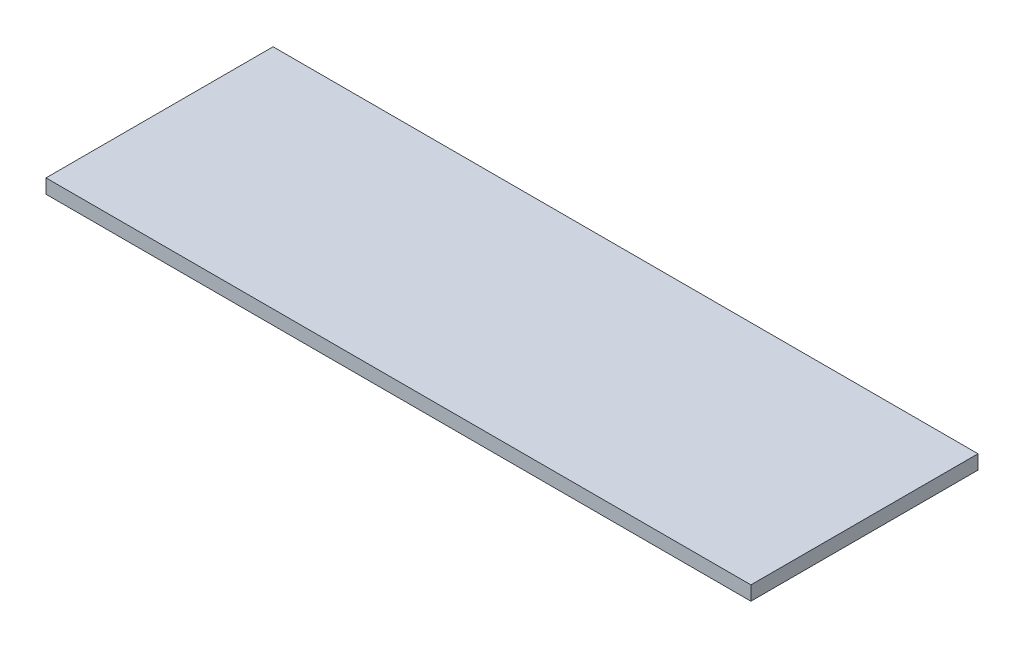
ISO-10303-21;
HEADER;
FILE_DESCRIPTION(('STEP AP214'),'2;1');
FILE_NAME('part.step','',(''),(''),'','','');
FILE_SCHEMA(('AUTOMOTIVE_DESIGN { 1 0 10303 214 1 1 1 1 }'));
ENDSEC;
DATA;
#1=APPLICATION_CONTEXT('core data for automotive mechanical design processes');
#2=APPLICATION_PROTOCOL_DEFINITION('international standard','automotive_design',2000,#1);
#3=PRODUCT_CONTEXT('',#1,'mechanical');
#4=PRODUCT('Part','Part','',(#3));
#5=PRODUCT_RELATED_PRODUCT_CATEGORY('part','',(#4));
#6=PRODUCT_DEFINITION_FORMATION('','',#4);
#7=PRODUCT_DEFINITION_CONTEXT('part definition',#1,'design');
#8=PRODUCT_DEFINITION('design','',#6,#7);
#9=PRODUCT_DEFINITION_SHAPE('','',#8);
#10=(LENGTH_UNIT() NAMED_UNIT(*) SI_UNIT(.MILLI.,.METRE.));
#11=(NAMED_UNIT(*) PLANE_ANGLE_UNIT() SI_UNIT($,.RADIAN.));
#12=(NAMED_UNIT(*) SI_UNIT($,.STERADIAN.) SOLID_ANGLE_UNIT());
#13=UNCERTAINTY_MEASURE_WITH_UNIT(LENGTH_MEASURE(1.E-05),#10,'distance_accuracy_value','');
#14=(GEOMETRIC_REPRESENTATION_CONTEXT(3) GLOBAL_UNCERTAINTY_ASSIGNED_CONTEXT((#13)) GLOBAL_UNIT_ASSIGNED_CONTEXT((#10,
#11,#12)) REPRESENTATION_CONTEXT('',''));
#15=CARTESIAN_POINT('',(0.,0.,0.));
#16=DIRECTION('',(0.,0.,1.));
#17=DIRECTION('',(1.,0.,0.));
#18=AXIS2_PLACEMENT_3D('',#15,#16,#17);
#19=CARTESIAN_POINT('',(-74.5,3.,24.));
#20=DIRECTION('',(1.,0.,0.));
#21=DIRECTION('',(0.,0.,-1.));
#22=AXIS2_PLACEMENT_3D('',#19,#20,#21);
#23=PLANE('',#22);
#24=DIRECTION('',(0.,0.,1.));
#25=VECTOR('',#24,1.);
#26=CARTESIAN_POINT('',(-74.5,0.,24.));
#27=LINE('',#26,#25);
#28=CARTESIAN_POINT('',(-74.5,0.,-24.));
#29=VERTEX_POINT('',#28);
#30=CARTESIAN_POINT('',(-74.5,0.,24.));
#31=VERTEX_POINT('',#30);
#32=EDGE_CURVE('E100',#29,#31,#27,.T.);
#33=ORIENTED_EDGE('',*,*,#32,.T.);
#34=DIRECTION('',(0.,-1.,0.));
#35=VECTOR('',#34,1.);
#36=CARTESIAN_POINT('',(-74.5,3.,24.));
#37=LINE('',#36,#35);
#38=CARTESIAN_POINT('',(-74.5,3.,24.));
#39=VERTEX_POINT('',#38);
#40=EDGE_CURVE('E11',#39,#31,#37,.T.);
#41=ORIENTED_EDGE('',*,*,#40,.F.);
#42=DIRECTION('',(0.,0.,1.));
#43=VECTOR('',#42,1.);
#44=CARTESIAN_POINT('',(-74.5,3.,24.));
#45=LINE('',#44,#43);
#46=CARTESIAN_POINT('',(-74.5,3.,-24.));
#47=VERTEX_POINT('',#46);
#48=EDGE_CURVE('E88',#47,#39,#45,.T.);
#49=ORIENTED_EDGE('',*,*,#48,.F.);
#50=DIRECTION('',(0.,-1.,0.));
#51=VECTOR('',#50,1.);
#52=CARTESIAN_POINT('',(-74.5,3.,-24.));
#53=LINE('',#52,#51);
#54=EDGE_CURVE('E96',#47,#29,#53,.T.);
#55=ORIENTED_EDGE('',*,*,#54,.T.);
#56=EDGE_LOOP('',(#33,#41,#49,#55));
#57=FACE_BOUND('',#56,.T.);
#58=ADVANCED_FACE('F37',(#57),#23,.F.);
#59=CARTESIAN_POINT('',(74.5,3.,24.));
#60=DIRECTION('',(0.,0.,-1.));
#61=DIRECTION('',(-1.,0.,0.));
#62=AXIS2_PLACEMENT_3D('',#59,#60,#61);
#63=PLANE('',#62);
#64=DIRECTION('',(1.,0.,0.));
#65=VECTOR('',#64,1.);
#66=CARTESIAN_POINT('',(74.5,0.,24.));
#67=LINE('',#66,#65);
#68=CARTESIAN_POINT('',(74.5,0.,24.));
#69=VERTEX_POINT('',#68);
#70=EDGE_CURVE('E92',#31,#69,#67,.T.);
#71=ORIENTED_EDGE('',*,*,#70,.T.);
#72=DIRECTION('',(0.,-1.,0.));
#73=VECTOR('',#72,1.);
#74=CARTESIAN_POINT('',(74.5,3.,24.));
#75=LINE('',#74,#73);
#76=CARTESIAN_POINT('',(74.5,3.,24.));
#77=VERTEX_POINT('',#76);
#78=EDGE_CURVE('E45',#77,#69,#75,.T.);
#79=ORIENTED_EDGE('',*,*,#78,.F.);
#80=DIRECTION('',(1.,0.,0.));
#81=VECTOR('',#80,1.);
#82=CARTESIAN_POINT('',(74.5,3.,24.));
#83=LINE('',#82,#81);
#84=EDGE_CURVE('E83',#39,#77,#83,.T.);
#85=ORIENTED_EDGE('',*,*,#84,.F.);
#86=ORIENTED_EDGE('',*,*,#40,.T.);
#87=EDGE_LOOP('',(#71,#79,#85,#86));
#88=FACE_BOUND('',#87,.T.);
#89=ADVANCED_FACE('F91',(#88),#63,.F.);
#90=CARTESIAN_POINT('',(74.5,3.,24.));
#91=DIRECTION('',(-1.,0.,0.));
#92=DIRECTION('',(0.,0.,1.));
#93=AXIS2_PLACEMENT_3D('',#90,#91,#92);
#94=PLANE('',#93);
#95=DIRECTION('',(0.,0.,-1.));
#96=VECTOR('',#95,1.);
#97=CARTESIAN_POINT('',(74.5,0.,24.));
#98=LINE('',#97,#96);
#99=CARTESIAN_POINT('',(74.5,0.,-24.));
#100=VERTEX_POINT('',#99);
#101=EDGE_CURVE('E70',#69,#100,#98,.T.);
#102=ORIENTED_EDGE('',*,*,#101,.T.);
#103=DIRECTION('',(0.,-1.,0.));
#104=VECTOR('',#103,1.);
#105=CARTESIAN_POINT('',(74.5,3.,-24.));
#106=LINE('',#105,#104);
#107=CARTESIAN_POINT('',(74.5,3.,-24.));
#108=VERTEX_POINT('',#107);
#109=EDGE_CURVE('E93',#108,#100,#106,.T.);
#110=ORIENTED_EDGE('',*,*,#109,.F.);
#111=DIRECTION('',(0.,0.,-1.));
#112=VECTOR('',#111,1.);
#113=CARTESIAN_POINT('',(74.5,3.,24.));
#114=LINE('',#113,#112);
#115=EDGE_CURVE('E86',#77,#108,#114,.T.);
#116=ORIENTED_EDGE('',*,*,#115,.F.);
#117=ORIENTED_EDGE('',*,*,#78,.T.);
#118=EDGE_LOOP('',(#102,#110,#116,#117));
#119=FACE_BOUND('',#118,.T.);
#120=ADVANCED_FACE('F94',(#119),#94,.F.);
#121=CARTESIAN_POINT('',(74.5,3.,-24.));
#122=DIRECTION('',(0.,0.,1.));
#123=DIRECTION('',(1.,0.,0.));
#124=AXIS2_PLACEMENT_3D('',#121,#122,#123);
#125=PLANE('',#124);
#126=DIRECTION('',(-1.,0.,0.));
#127=VECTOR('',#126,1.);
#128=CARTESIAN_POINT('',(74.5,0.,-24.));
#129=LINE('',#128,#127);
#130=EDGE_CURVE('E76',#100,#29,#129,.T.);
#131=ORIENTED_EDGE('',*,*,#130,.T.);
#132=ORIENTED_EDGE('',*,*,#54,.F.);
#133=DIRECTION('',(-1.,0.,0.));
#134=VECTOR('',#133,1.);
#135=CARTESIAN_POINT('',(74.5,3.,-24.));
#136=LINE('',#135,#134);
#137=EDGE_CURVE('E53',#108,#47,#136,.T.);
#138=ORIENTED_EDGE('',*,*,#137,.F.);
#139=ORIENTED_EDGE('',*,*,#109,.T.);
#140=EDGE_LOOP('',(#131,#132,#138,#139));
#141=FACE_BOUND('',#140,.T.);
#142=ADVANCED_FACE('F107',(#141),#125,.F.);
#143=CARTESIAN_POINT('',(0.,3.,0.));
#144=DIRECTION('',(0.,1.,0.));
#145=DIRECTION('',(0.,0.,1.));
#146=AXIS2_PLACEMENT_3D('',#143,#144,#145);
#147=PLANE('',#146);
#148=ORIENTED_EDGE('',*,*,#48,.T.);
#149=ORIENTED_EDGE('',*,*,#84,.T.);
#150=ORIENTED_EDGE('',*,*,#115,.T.);
#151=ORIENTED_EDGE('',*,*,#137,.T.);
#152=EDGE_LOOP('',(#148,#149,#150,#151));
#153=FACE_BOUND('',#152,.T.);
#154=ADVANCED_FACE('F84',(#153),#147,.T.);
#155=CARTESIAN_POINT('',(0.,0.,0.));
#156=DIRECTION('',(0.,1.,0.));
#157=DIRECTION('',(0.,0.,1.));
#158=AXIS2_PLACEMENT_3D('',#155,#156,#157);
#159=PLANE('',#158);
#160=ORIENTED_EDGE('',*,*,#32,.F.);
#161=ORIENTED_EDGE('',*,*,#130,.F.);
#162=ORIENTED_EDGE('',*,*,#101,.F.);
#163=ORIENTED_EDGE('',*,*,#70,.F.);
#164=EDGE_LOOP('',(#160,#161,#162,#163));
#165=FACE_BOUND('',#164,.T.);
#166=ADVANCED_FACE('F110',(#165),#159,.F.);
#167=CLOSED_SHELL('',(#58,#89,#120,#142,#154,#166));
#168=MANIFOLD_SOLID_BREP('B2',#167);
#169=ADVANCED_BREP_SHAPE_REPRESENTATION('',(#18,#168),#14);
#170=SHAPE_DEFINITION_REPRESENTATION(#9,#169);
ENDSEC;
END-ISO-10303-21;
